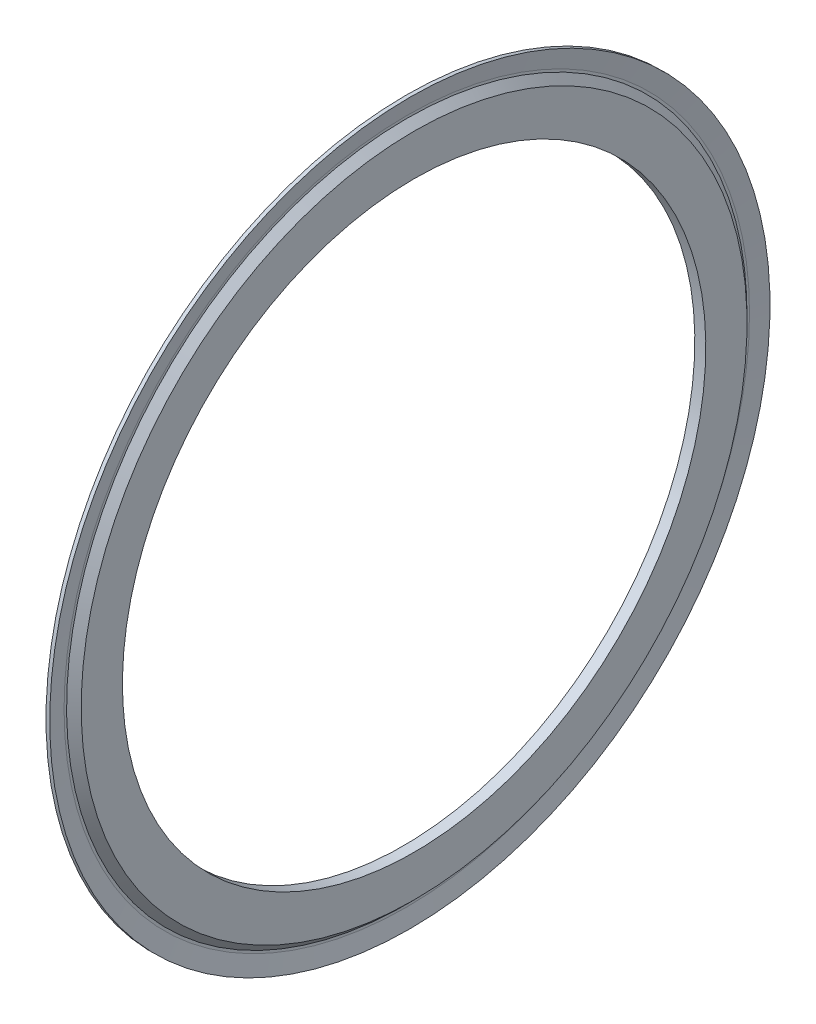
ISO-10303-21;
HEADER;
FILE_DESCRIPTION(('STEP AP214'),'2;1');
FILE_NAME('part.step','',(''),(''),'','','');
FILE_SCHEMA(('AUTOMOTIVE_DESIGN { 1 0 10303 214 1 1 1 1 }'));
ENDSEC;
DATA;
#1=APPLICATION_CONTEXT('core data for automotive mechanical design processes');
#2=APPLICATION_PROTOCOL_DEFINITION('international standard','automotive_design',2000,#1);
#3=PRODUCT_CONTEXT('',#1,'mechanical');
#4=PRODUCT('Part','Part','',(#3));
#5=PRODUCT_RELATED_PRODUCT_CATEGORY('part','',(#4));
#6=PRODUCT_DEFINITION_FORMATION('','',#4);
#7=PRODUCT_DEFINITION_CONTEXT('part definition',#1,'design');
#8=PRODUCT_DEFINITION('design','',#6,#7);
#9=PRODUCT_DEFINITION_SHAPE('','',#8);
#10=(LENGTH_UNIT() NAMED_UNIT(*) SI_UNIT(.MILLI.,.METRE.));
#11=(NAMED_UNIT(*) PLANE_ANGLE_UNIT() SI_UNIT($,.RADIAN.));
#12=(NAMED_UNIT(*) SI_UNIT($,.STERADIAN.) SOLID_ANGLE_UNIT());
#13=UNCERTAINTY_MEASURE_WITH_UNIT(LENGTH_MEASURE(1.E-05),#10,'distance_accuracy_value','');
#14=(GEOMETRIC_REPRESENTATION_CONTEXT(3) GLOBAL_UNCERTAINTY_ASSIGNED_CONTEXT((#13)) GLOBAL_UNIT_ASSIGNED_CONTEXT((#10,
#11,#12)) REPRESENTATION_CONTEXT('',''));
#15=CARTESIAN_POINT('',(0.,0.,0.));
#16=DIRECTION('',(0.,0.,1.));
#17=DIRECTION('',(1.,0.,0.));
#18=AXIS2_PLACEMENT_3D('',#15,#16,#17);
#19=CARTESIAN_POINT('',(16.3568925512663,39.102,0.));
#20=DIRECTION('',(-1.,0.,0.));
#21=DIRECTION('',(0.,-1.,0.));
#22=AXIS2_PLACEMENT_3D('',#19,#20,#21);
#23=PLANE('',#22);
#24=CARTESIAN_POINT('',(16.3568925512663,0.,0.));
#25=DIRECTION('',(1.,0.,0.));
#26=DIRECTION('',(0.,1.,0.));
#27=AXIS2_PLACEMENT_3D('',#24,#25,#26);
#28=CIRCLE('',#27,38.854);
#29=CARTESIAN_POINT('',(16.3568925512663,38.854,0.));
#30=VERTEX_POINT('',#29);
#31=EDGE_CURVE('E11',#30,#30,#28,.T.);
#32=ORIENTED_EDGE('',*,*,#31,.T.);
#33=EDGE_LOOP('',(#32));
#34=FACE_BOUND('',#33,.T.);
#35=CARTESIAN_POINT('',(16.3568925512663,0.,0.));
#36=DIRECTION('',(1.,0.,0.));
#37=DIRECTION('',(0.,1.,0.));
#38=AXIS2_PLACEMENT_3D('',#35,#36,#37);
#39=CIRCLE('',#38,39.35);
#40=CARTESIAN_POINT('',(16.3568925512663,39.35,0.));
#41=VERTEX_POINT('',#40);
#42=EDGE_CURVE('E65',#41,#41,#39,.T.);
#43=ORIENTED_EDGE('',*,*,#42,.F.);
#44=EDGE_LOOP('',(#43));
#45=FACE_BOUND('',#44,.T.);
#46=ADVANCED_FACE('F16',(#34,#45),#23,.T.);
#47=CARTESIAN_POINT('',(16.7768925512663,0.,0.));
#48=DIRECTION('',(-1.,0.,0.));
#49=DIRECTION('',(0.,1.,0.));
#50=AXIS2_PLACEMENT_3D('',#47,#48,#49);
#51=CONICAL_SURFACE('',#50,38.434,0.785398163397443);
#52=CARTESIAN_POINT('',(17.1968925512663,0.,0.));
#53=DIRECTION('',(1.,0.,0.));
#54=DIRECTION('',(0.,1.,0.));
#55=AXIS2_PLACEMENT_3D('',#52,#53,#54);
#56=CIRCLE('',#55,38.014);
#57=CARTESIAN_POINT('',(17.1968925512663,38.014,0.));
#58=VERTEX_POINT('',#57);
#59=EDGE_CURVE('E26',#58,#58,#56,.T.);
#60=ORIENTED_EDGE('',*,*,#59,.T.);
#61=EDGE_LOOP('',(#60));
#62=FACE_BOUND('',#61,.T.);
#63=ORIENTED_EDGE('',*,*,#31,.F.);
#64=EDGE_LOOP('',(#63));
#65=FACE_BOUND('',#64,.T.);
#66=ADVANCED_FACE('F102',(#62,#65),#51,.F.);
#67=CARTESIAN_POINT('',(17.1968925512663,35.947,0.));
#68=DIRECTION('',(-1.,0.,0.));
#69=DIRECTION('',(0.,-1.,0.));
#70=AXIS2_PLACEMENT_3D('',#67,#68,#69);
#71=PLANE('',#70);
#72=CARTESIAN_POINT('',(17.1968925512663,0.,0.));
#73=DIRECTION('',(1.,0.,0.));
#74=DIRECTION('',(0.,1.,0.));
#75=AXIS2_PLACEMENT_3D('',#72,#73,#74);
#76=CIRCLE('',#75,33.88);
#77=CARTESIAN_POINT('',(17.1968925512663,33.88,0.));
#78=VERTEX_POINT('',#77);
#79=EDGE_CURVE('E70',#78,#78,#76,.T.);
#80=ORIENTED_EDGE('',*,*,#79,.T.);
#81=EDGE_LOOP('',(#80));
#82=FACE_BOUND('',#81,.T.);
#83=ORIENTED_EDGE('',*,*,#59,.F.);
#84=EDGE_LOOP('',(#83));
#85=FACE_BOUND('',#84,.T.);
#86=ADVANCED_FACE('F99',(#82,#85),#71,.T.);
#87=CARTESIAN_POINT('',(16.7768925512663,0.,0.));
#88=DIRECTION('',(-1.,0.,0.));
#89=DIRECTION('',(0.,1.,0.));
#90=AXIS2_PLACEMENT_3D('',#87,#88,#89);
#91=CYLINDRICAL_SURFACE('',#90,33.88);
#92=CARTESIAN_POINT('',(16.3568925512663,0.,0.));
#93=DIRECTION('',(1.,0.,0.));
#94=DIRECTION('',(0.,1.,0.));
#95=AXIS2_PLACEMENT_3D('',#92,#93,#94);
#96=CIRCLE('',#95,33.88);
#97=CARTESIAN_POINT('',(16.3568925512663,33.88,0.));
#98=VERTEX_POINT('',#97);
#99=EDGE_CURVE('E72',#98,#98,#96,.T.);
#100=ORIENTED_EDGE('',*,*,#99,.T.);
#101=EDGE_LOOP('',(#100));
#102=FACE_BOUND('',#101,.T.);
#103=ORIENTED_EDGE('',*,*,#79,.F.);
#104=EDGE_LOOP('',(#103));
#105=FACE_BOUND('',#104,.T.);
#106=ADVANCED_FACE('F85',(#102,#105),#91,.T.);
#107=CARTESIAN_POINT('',(16.3568925512663,33.67,0.));
#108=DIRECTION('',(-1.,0.,0.));
#109=DIRECTION('',(0.,-1.,0.));
#110=AXIS2_PLACEMENT_3D('',#107,#108,#109);
#111=PLANE('',#110);
#112=CARTESIAN_POINT('',(16.3568925512663,0.,0.));
#113=DIRECTION('',(1.,0.,0.));
#114=DIRECTION('',(0.,1.,0.));
#115=AXIS2_PLACEMENT_3D('',#112,#113,#114);
#116=CIRCLE('',#115,33.46);
#117=CARTESIAN_POINT('',(16.3568925512663,33.46,0.));
#118=VERTEX_POINT('',#117);
#119=EDGE_CURVE('E79',#118,#118,#116,.T.);
#120=ORIENTED_EDGE('',*,*,#119,.T.);
#121=EDGE_LOOP('',(#120));
#122=FACE_BOUND('',#121,.T.);
#123=ORIENTED_EDGE('',*,*,#99,.F.);
#124=EDGE_LOOP('',(#123));
#125=FACE_BOUND('',#124,.T.);
#126=ADVANCED_FACE('F18',(#122,#125),#111,.T.);
#127=CARTESIAN_POINT('',(16.9868925512663,0.,0.));
#128=DIRECTION('',(-1.,0.,0.));
#129=DIRECTION('',(0.,1.,0.));
#130=AXIS2_PLACEMENT_3D('',#127,#128,#129);
#131=CYLINDRICAL_SURFACE('',#130,33.46);
#132=CARTESIAN_POINT('',(17.6168925512663,0.,0.));
#133=DIRECTION('',(1.,0.,0.));
#134=DIRECTION('',(0.,1.,0.));
#135=AXIS2_PLACEMENT_3D('',#132,#133,#134);
#136=CIRCLE('',#135,33.46);
#137=CARTESIAN_POINT('',(17.6168925512663,33.46,0.));
#138=VERTEX_POINT('',#137);
#139=EDGE_CURVE('E20',#138,#138,#136,.T.);
#140=ORIENTED_EDGE('',*,*,#139,.T.);
#141=EDGE_LOOP('',(#140));
#142=FACE_BOUND('',#141,.T.);
#143=ORIENTED_EDGE('',*,*,#119,.F.);
#144=EDGE_LOOP('',(#143));
#145=FACE_BOUND('',#144,.T.);
#146=ADVANCED_FACE('F89',(#142,#145),#131,.F.);
#147=CARTESIAN_POINT('',(17.6168925512663,35.8239848480983,0.));
#148=DIRECTION('',(1.,0.,0.));
#149=DIRECTION('',(0.,1.,0.));
#150=AXIS2_PLACEMENT_3D('',#147,#148,#149);
#151=PLANE('',#150);
#152=CARTESIAN_POINT('',(17.6168925512663,0.,0.));
#153=DIRECTION('',(1.,0.,0.));
#154=DIRECTION('',(0.,1.,0.));
#155=AXIS2_PLACEMENT_3D('',#152,#153,#154);
#156=CIRCLE('',#155,38.1879696961967);
#157=CARTESIAN_POINT('',(17.6168925512663,38.1879696961967,0.));
#158=VERTEX_POINT('',#157);
#159=EDGE_CURVE('E75',#158,#158,#156,.T.);
#160=ORIENTED_EDGE('',*,*,#159,.T.);
#161=EDGE_LOOP('',(#160));
#162=FACE_BOUND('',#161,.T.);
#163=ORIENTED_EDGE('',*,*,#139,.F.);
#164=EDGE_LOOP('',(#163));
#165=FACE_BOUND('',#164,.T.);
#166=ADVANCED_FACE('F96',(#162,#165),#151,.T.);
#167=CARTESIAN_POINT('',(17.1968925512663,0.,0.));
#168=DIRECTION('',(-1.,0.,0.));
#169=DIRECTION('',(0.,1.,0.));
#170=AXIS2_PLACEMENT_3D('',#167,#168,#169);
#171=CONICAL_SURFACE('',#170,38.6079696961967,0.785398163397443);
#172=CARTESIAN_POINT('',(16.7768925512663,0.,0.));
#173=DIRECTION('',(1.,0.,0.));
#174=DIRECTION('',(0.,1.,0.));
#175=AXIS2_PLACEMENT_3D('',#172,#173,#174);
#176=CIRCLE('',#175,39.0279696961967);
#177=CARTESIAN_POINT('',(16.7768925512663,39.0279696961967,0.));
#178=VERTEX_POINT('',#177);
#179=EDGE_CURVE('E73',#178,#178,#176,.T.);
#180=ORIENTED_EDGE('',*,*,#179,.T.);
#181=EDGE_LOOP('',(#180));
#182=FACE_BOUND('',#181,.T.);
#183=ORIENTED_EDGE('',*,*,#159,.F.);
#184=EDGE_LOOP('',(#183));
#185=FACE_BOUND('',#184,.T.);
#186=ADVANCED_FACE('F112',(#182,#185),#171,.T.);
#187=CARTESIAN_POINT('',(16.7768925512663,39.1706122287579,0.));
#188=DIRECTION('',(1.,0.,0.));
#189=DIRECTION('',(0.,1.,0.));
#190=AXIS2_PLACEMENT_3D('',#187,#188,#189);
#191=PLANE('',#190);
#192=CARTESIAN_POINT('',(16.7768925512663,0.,0.));
#193=DIRECTION('',(1.,0.,0.));
#194=DIRECTION('',(0.,1.,0.));
#195=AXIS2_PLACEMENT_3D('',#192,#193,#194);
#196=CIRCLE('',#195,39.3132547613191);
#197=CARTESIAN_POINT('',(16.7768925512663,39.3132547613191,0.));
#198=VERTEX_POINT('',#197);
#199=EDGE_CURVE('E76',#198,#198,#196,.T.);
#200=ORIENTED_EDGE('',*,*,#199,.T.);
#201=EDGE_LOOP('',(#200));
#202=FACE_BOUND('',#201,.T.);
#203=ORIENTED_EDGE('',*,*,#179,.F.);
#204=EDGE_LOOP('',(#203));
#205=FACE_BOUND('',#204,.T.);
#206=ADVANCED_FACE('F114',(#202,#205),#191,.T.);
#207=CARTESIAN_POINT('',(16.9529325808566,0.,0.));
#208=DIRECTION('',(1.,0.,0.));
#209=DIRECTION('',(0.,1.,0.));
#210=AXIS2_PLACEMENT_3D('',#207,#208,#209);
#211=CONICAL_SURFACE('',#210,40.3116273806596,1.39626340159546);
#212=CARTESIAN_POINT('',(17.1289726104469,0.,0.));
#213=DIRECTION('',(1.,0.,0.));
#214=DIRECTION('',(0.,1.,0.));
#215=AXIS2_PLACEMENT_3D('',#212,#213,#214);
#216=CIRCLE('',#215,41.31);
#217=CARTESIAN_POINT('',(17.1289726104469,41.31,0.));
#218=VERTEX_POINT('',#217);
#219=EDGE_CURVE('E67',#218,#218,#216,.T.);
#220=ORIENTED_EDGE('',*,*,#219,.T.);
#221=EDGE_LOOP('',(#220));
#222=FACE_BOUND('',#221,.T.);
#223=ORIENTED_EDGE('',*,*,#199,.F.);
#224=EDGE_LOOP('',(#223));
#225=FACE_BOUND('',#224,.T.);
#226=ADVANCED_FACE('F122',(#222,#225),#211,.F.);
#227=CARTESIAN_POINT('',(16.9157330219509,0.,0.));
#228=DIRECTION('',(-1.,0.,0.));
#229=DIRECTION('',(0.,1.,0.));
#230=AXIS2_PLACEMENT_3D('',#227,#228,#229);
#231=CYLINDRICAL_SURFACE('',#230,41.31);
#232=CARTESIAN_POINT('',(16.7024934334549,0.,0.));
#233=DIRECTION('',(1.,0.,0.));
#234=DIRECTION('',(0.,1.,0.));
#235=AXIS2_PLACEMENT_3D('',#232,#233,#234);
#236=CIRCLE('',#235,41.31);
#237=CARTESIAN_POINT('',(16.7024934334549,41.31,0.));
#238=VERTEX_POINT('',#237);
#239=EDGE_CURVE('E61',#238,#238,#236,.T.);
#240=ORIENTED_EDGE('',*,*,#239,.T.);
#241=EDGE_LOOP('',(#240));
#242=FACE_BOUND('',#241,.T.);
#243=ORIENTED_EDGE('',*,*,#219,.F.);
#244=EDGE_LOOP('',(#243));
#245=FACE_BOUND('',#244,.T.);
#246=ADVANCED_FACE('F62',(#242,#245),#231,.T.);
#247=CARTESIAN_POINT('',(16.5296929923606,0.,0.));
#248=DIRECTION('',(1.,0.,0.));
#249=DIRECTION('',(0.,1.,0.));
#250=AXIS2_PLACEMENT_3D('',#247,#248,#249);
#251=CONICAL_SURFACE('',#250,40.33,1.39626340159546);
#252=ORIENTED_EDGE('',*,*,#42,.T.);
#253=EDGE_LOOP('',(#252));
#254=FACE_BOUND('',#253,.T.);
#255=ORIENTED_EDGE('',*,*,#239,.F.);
#256=EDGE_LOOP('',(#255));
#257=FACE_BOUND('',#256,.T.);
#258=ADVANCED_FACE('F116',(#254,#257),#251,.T.);
#259=CLOSED_SHELL('',(#46,#66,#86,#106,#126,#146,#166,#186,#206,#226,#246,#258));
#260=MANIFOLD_SOLID_BREP('B1',#259);
#261=ADVANCED_BREP_SHAPE_REPRESENTATION('',(#18,#260),#14);
#262=SHAPE_DEFINITION_REPRESENTATION(#9,#261);
ENDSEC;
END-ISO-10303-21;
